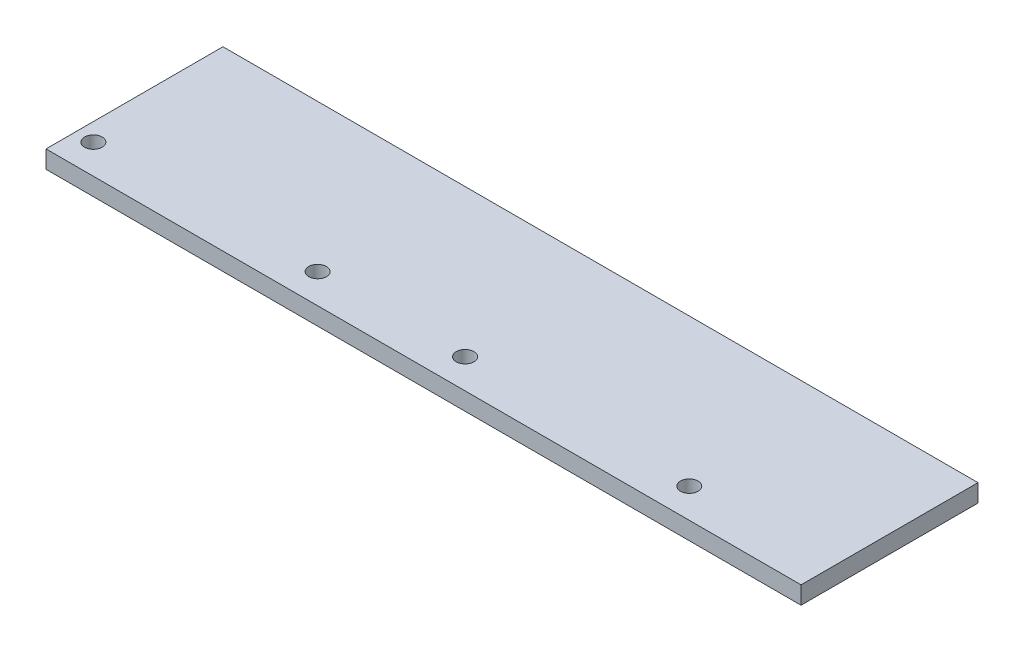
ISO-10303-21;
HEADER;
FILE_DESCRIPTION(('STEP AP214'),'2;1');
FILE_NAME('part.step','',(''),(''),'','','');
FILE_SCHEMA(('AUTOMOTIVE_DESIGN { 1 0 10303 214 1 1 1 1 }'));
ENDSEC;
DATA;
#1=APPLICATION_CONTEXT('core data for automotive mechanical design processes');
#2=APPLICATION_PROTOCOL_DEFINITION('international standard','automotive_design',2000,#1);
#3=PRODUCT_CONTEXT('',#1,'mechanical');
#4=PRODUCT('Part','Part','',(#3));
#5=PRODUCT_RELATED_PRODUCT_CATEGORY('part','',(#4));
#6=PRODUCT_DEFINITION_FORMATION('','',#4);
#7=PRODUCT_DEFINITION_CONTEXT('part definition',#1,'design');
#8=PRODUCT_DEFINITION('design','',#6,#7);
#9=PRODUCT_DEFINITION_SHAPE('','',#8);
#10=(LENGTH_UNIT() NAMED_UNIT(*) SI_UNIT(.MILLI.,.METRE.));
#11=(NAMED_UNIT(*) PLANE_ANGLE_UNIT() SI_UNIT($,.RADIAN.));
#12=(NAMED_UNIT(*) SI_UNIT($,.STERADIAN.) SOLID_ANGLE_UNIT());
#13=UNCERTAINTY_MEASURE_WITH_UNIT(LENGTH_MEASURE(1.E-05),#10,'distance_accuracy_value','');
#14=(GEOMETRIC_REPRESENTATION_CONTEXT(3) GLOBAL_UNCERTAINTY_ASSIGNED_CONTEXT((#13)) GLOBAL_UNIT_ASSIGNED_CONTEXT((#10,
#11,#12)) REPRESENTATION_CONTEXT('',''));
#15=CARTESIAN_POINT('',(0.,0.,0.));
#16=DIRECTION('',(0.,0.,1.));
#17=DIRECTION('',(1.,0.,0.));
#18=AXIS2_PLACEMENT_3D('',#15,#16,#17);
#19=CARTESIAN_POINT('',(0.,19.05,0.));
#20=DIRECTION('',(1.,0.,0.));
#21=DIRECTION('',(0.,0.,-1.));
#22=AXIS2_PLACEMENT_3D('',#19,#20,#21);
#23=PLANE('',#22);
#24=DIRECTION('',(0.,0.,1.));
#25=VECTOR('',#24,1.);
#26=CARTESIAN_POINT('',(0.,0.,0.));
#27=LINE('',#26,#25);
#28=CARTESIAN_POINT('',(0.,0.,0.));
#29=VERTEX_POINT('',#28);
#30=CARTESIAN_POINT('',(0.,0.,190.5));
#31=VERTEX_POINT('',#30);
#32=EDGE_CURVE('E105',#29,#31,#27,.T.);
#33=ORIENTED_EDGE('',*,*,#32,.T.);
#34=DIRECTION('',(0.,-1.,0.));
#35=VECTOR('',#34,1.);
#36=CARTESIAN_POINT('',(0.,19.05,190.5));
#37=LINE('',#36,#35);
#38=CARTESIAN_POINT('',(0.,19.05,190.5));
#39=VERTEX_POINT('',#38);
#40=EDGE_CURVE('E11',#39,#31,#37,.T.);
#41=ORIENTED_EDGE('',*,*,#40,.F.);
#42=DIRECTION('',(0.,0.,1.));
#43=VECTOR('',#42,1.);
#44=CARTESIAN_POINT('',(0.,19.05,0.));
#45=LINE('',#44,#43);
#46=CARTESIAN_POINT('',(0.,19.05,0.));
#47=VERTEX_POINT('',#46);
#48=EDGE_CURVE('E89',#47,#39,#45,.T.);
#49=ORIENTED_EDGE('',*,*,#48,.F.);
#50=DIRECTION('',(0.,-1.,0.));
#51=VECTOR('',#50,1.);
#52=CARTESIAN_POINT('',(0.,19.05,0.));
#53=LINE('',#52,#51);
#54=EDGE_CURVE('E97',#47,#29,#53,.T.);
#55=ORIENTED_EDGE('',*,*,#54,.T.);
#56=EDGE_LOOP('',(#33,#41,#49,#55));
#57=FACE_BOUND('',#56,.T.);
#58=ADVANCED_FACE('F39',(#57),#23,.F.);
#59=CARTESIAN_POINT('',(0.,19.05,190.5));
#60=DIRECTION('',(0.,0.,-1.));
#61=DIRECTION('',(-1.,0.,0.));
#62=AXIS2_PLACEMENT_3D('',#59,#60,#61);
#63=PLANE('',#62);
#64=DIRECTION('',(1.,0.,0.));
#65=VECTOR('',#64,1.);
#66=CARTESIAN_POINT('',(0.,0.,190.5));
#67=LINE('',#66,#65);
#68=CARTESIAN_POINT('',(812.8,0.,190.5));
#69=VERTEX_POINT('',#68);
#70=EDGE_CURVE('E92',#31,#69,#67,.T.);
#71=ORIENTED_EDGE('',*,*,#70,.T.);
#72=DIRECTION('',(0.,-1.,0.));
#73=VECTOR('',#72,1.);
#74=CARTESIAN_POINT('',(812.8,19.05,190.5));
#75=LINE('',#74,#73);
#76=CARTESIAN_POINT('',(812.8,19.05,190.5));
#77=VERTEX_POINT('',#76);
#78=EDGE_CURVE('E50',#77,#69,#75,.T.);
#79=ORIENTED_EDGE('',*,*,#78,.F.);
#80=DIRECTION('',(1.,0.,0.));
#81=VECTOR('',#80,1.);
#82=CARTESIAN_POINT('',(0.,19.05,190.5));
#83=LINE('',#82,#81);
#84=EDGE_CURVE('E82',#39,#77,#83,.T.);
#85=ORIENTED_EDGE('',*,*,#84,.F.);
#86=ORIENTED_EDGE('',*,*,#40,.T.);
#87=EDGE_LOOP('',(#71,#79,#85,#86));
#88=FACE_BOUND('',#87,.T.);
#89=ADVANCED_FACE('F93',(#88),#63,.F.);
#90=CARTESIAN_POINT('',(812.8,19.05,0.));
#91=DIRECTION('',(-1.,0.,0.));
#92=DIRECTION('',(0.,0.,1.));
#93=AXIS2_PLACEMENT_3D('',#90,#91,#92);
#94=PLANE('',#93);
#95=DIRECTION('',(0.,0.,-1.));
#96=VECTOR('',#95,1.);
#97=CARTESIAN_POINT('',(812.8,0.,0.));
#98=LINE('',#97,#96);
#99=CARTESIAN_POINT('',(812.8,0.,0.));
#100=VERTEX_POINT('',#99);
#101=EDGE_CURVE('E75',#69,#100,#98,.T.);
#102=ORIENTED_EDGE('',*,*,#101,.T.);
#103=DIRECTION('',(0.,-1.,0.));
#104=VECTOR('',#103,1.);
#105=CARTESIAN_POINT('',(812.8,19.05,0.));
#106=LINE('',#105,#104);
#107=CARTESIAN_POINT('',(812.8,19.05,0.));
#108=VERTEX_POINT('',#107);
#109=EDGE_CURVE('E94',#108,#100,#106,.T.);
#110=ORIENTED_EDGE('',*,*,#109,.F.);
#111=DIRECTION('',(0.,0.,-1.));
#112=VECTOR('',#111,1.);
#113=CARTESIAN_POINT('',(812.8,19.05,0.));
#114=LINE('',#113,#112);
#115=EDGE_CURVE('E88',#77,#108,#114,.T.);
#116=ORIENTED_EDGE('',*,*,#115,.F.);
#117=ORIENTED_EDGE('',*,*,#78,.T.);
#118=EDGE_LOOP('',(#102,#110,#116,#117));
#119=FACE_BOUND('',#118,.T.);
#120=ADVANCED_FACE('F96',(#119),#94,.F.);
#121=CARTESIAN_POINT('',(0.,19.05,0.));
#122=DIRECTION('',(0.,0.,1.));
#123=DIRECTION('',(1.,0.,0.));
#124=AXIS2_PLACEMENT_3D('',#121,#122,#123);
#125=PLANE('',#124);
#126=DIRECTION('',(-1.,0.,0.));
#127=VECTOR('',#126,1.);
#128=CARTESIAN_POINT('',(0.,0.,0.));
#129=LINE('',#128,#127);
#130=EDGE_CURVE('E76',#100,#29,#129,.T.);
#131=ORIENTED_EDGE('',*,*,#130,.T.);
#132=ORIENTED_EDGE('',*,*,#54,.F.);
#133=DIRECTION('',(-1.,0.,0.));
#134=VECTOR('',#133,1.);
#135=CARTESIAN_POINT('',(0.,19.05,0.));
#136=LINE('',#135,#134);
#137=EDGE_CURVE('E54',#108,#47,#136,.T.);
#138=ORIENTED_EDGE('',*,*,#137,.F.);
#139=ORIENTED_EDGE('',*,*,#109,.T.);
#140=EDGE_LOOP('',(#131,#132,#138,#139));
#141=FACE_BOUND('',#140,.T.);
#142=ADVANCED_FACE('F106',(#141),#125,.F.);
#143=CARTESIAN_POINT('',(0.,19.05,0.));
#144=DIRECTION('',(0.,1.,0.));
#145=DIRECTION('',(0.,0.,1.));
#146=AXIS2_PLACEMENT_3D('',#143,#144,#145);
#147=PLANE('',#146);
#148=CARTESIAN_POINT('',(19.1470487132102,19.05,158.66737781704));
#149=DIRECTION('',(0.,1.,0.));
#150=DIRECTION('',(0.,0.,1.));
#151=AXIS2_PLACEMENT_3D('',#148,#149,#150);
#152=CIRCLE('',#151,9.525);
#153=CARTESIAN_POINT('',(19.1470487132102,19.05,168.19237781704));
#154=VERTEX_POINT('',#153);
#155=EDGE_CURVE('E132',#154,#154,#152,.T.);
#156=ORIENTED_EDGE('',*,*,#155,.F.);
#157=EDGE_LOOP('',(#156));
#158=FACE_BOUND('',#157,.T.);
#159=CARTESIAN_POINT('',(260.547124516888,19.05,158.66737781704));
#160=DIRECTION('',(0.,1.,0.));
#161=DIRECTION('',(0.,0.,1.));
#162=AXIS2_PLACEMENT_3D('',#159,#160,#161);
#163=CIRCLE('',#162,9.52500000000002);
#164=CARTESIAN_POINT('',(260.547124516888,19.05,168.19237781704));
#165=VERTEX_POINT('',#164);
#166=EDGE_CURVE('E131',#165,#165,#163,.T.);
#167=ORIENTED_EDGE('',*,*,#166,.F.);
#168=EDGE_LOOP('',(#167));
#169=FACE_BOUND('',#168,.T.);
#170=CARTESIAN_POINT('',(419.288921469703,19.05,158.66737781704));
#171=DIRECTION('',(0.,1.,0.));
#172=DIRECTION('',(0.,0.,1.));
#173=AXIS2_PLACEMENT_3D('',#170,#171,#172);
#174=CIRCLE('',#173,9.52500000000002);
#175=CARTESIAN_POINT('',(419.288921469703,19.05,168.19237781704));
#176=VERTEX_POINT('',#175);
#177=EDGE_CURVE('E124',#176,#176,#174,.T.);
#178=ORIENTED_EDGE('',*,*,#177,.F.);
#179=EDGE_LOOP('',(#178));
#180=FACE_BOUND('',#179,.T.);
#181=CARTESIAN_POINT('',(660.646560832095,19.05,158.66737781704));
#182=DIRECTION('',(0.,1.,0.));
#183=DIRECTION('',(0.,0.,1.));
#184=AXIS2_PLACEMENT_3D('',#181,#182,#183);
#185=CIRCLE('',#184,9.52500000000002);
#186=CARTESIAN_POINT('',(660.646560832095,19.05,168.19237781704));
#187=VERTEX_POINT('',#186);
#188=EDGE_CURVE('E119',#187,#187,#185,.T.);
#189=ORIENTED_EDGE('',*,*,#188,.F.);
#190=EDGE_LOOP('',(#189));
#191=FACE_BOUND('',#190,.T.);
#192=ORIENTED_EDGE('',*,*,#48,.T.);
#193=ORIENTED_EDGE('',*,*,#84,.T.);
#194=ORIENTED_EDGE('',*,*,#115,.T.);
#195=ORIENTED_EDGE('',*,*,#137,.T.);
#196=EDGE_LOOP('',(#192,#193,#194,#195));
#197=FACE_BOUND('',#196,.T.);
#198=ADVANCED_FACE('F86',(#158,#169,#180,#191,#197),#147,.T.);
#199=CARTESIAN_POINT('',(0.,0.,0.));
#200=DIRECTION('',(0.,1.,0.));
#201=DIRECTION('',(0.,0.,1.));
#202=AXIS2_PLACEMENT_3D('',#199,#200,#201);
#203=PLANE('',#202);
#204=CARTESIAN_POINT('',(19.1470487132102,0.,158.66737781704));
#205=DIRECTION('',(0.,1.,0.));
#206=DIRECTION('',(0.,0.,1.));
#207=AXIS2_PLACEMENT_3D('',#204,#205,#206);
#208=CIRCLE('',#207,9.525);
#209=CARTESIAN_POINT('',(19.1470487132102,0.,168.19237781704));
#210=VERTEX_POINT('',#209);
#211=EDGE_CURVE('E103',#210,#210,#208,.T.);
#212=ORIENTED_EDGE('',*,*,#211,.T.);
#213=EDGE_LOOP('',(#212));
#214=FACE_BOUND('',#213,.T.);
#215=CARTESIAN_POINT('',(260.547124516888,0.,158.66737781704));
#216=DIRECTION('',(0.,1.,0.));
#217=DIRECTION('',(0.,0.,1.));
#218=AXIS2_PLACEMENT_3D('',#215,#216,#217);
#219=CIRCLE('',#218,9.52500000000002);
#220=CARTESIAN_POINT('',(260.547124516888,0.,168.19237781704));
#221=VERTEX_POINT('',#220);
#222=EDGE_CURVE('E126',#221,#221,#219,.T.);
#223=ORIENTED_EDGE('',*,*,#222,.T.);
#224=EDGE_LOOP('',(#223));
#225=FACE_BOUND('',#224,.T.);
#226=CARTESIAN_POINT('',(419.288921469703,0.,158.66737781704));
#227=DIRECTION('',(0.,1.,0.));
#228=DIRECTION('',(0.,0.,1.));
#229=AXIS2_PLACEMENT_3D('',#226,#227,#228);
#230=CIRCLE('',#229,9.52500000000002);
#231=CARTESIAN_POINT('',(419.288921469703,0.,168.19237781704));
#232=VERTEX_POINT('',#231);
#233=EDGE_CURVE('E122',#232,#232,#230,.T.);
#234=ORIENTED_EDGE('',*,*,#233,.T.);
#235=EDGE_LOOP('',(#234));
#236=FACE_BOUND('',#235,.T.);
#237=CARTESIAN_POINT('',(660.646560832095,0.,158.66737781704));
#238=DIRECTION('',(0.,1.,0.));
#239=DIRECTION('',(0.,0.,1.));
#240=AXIS2_PLACEMENT_3D('',#237,#238,#239);
#241=CIRCLE('',#240,9.52500000000002);
#242=CARTESIAN_POINT('',(660.646560832095,0.,168.19237781704));
#243=VERTEX_POINT('',#242);
#244=EDGE_CURVE('E117',#243,#243,#241,.T.);
#245=ORIENTED_EDGE('',*,*,#244,.T.);
#246=EDGE_LOOP('',(#245));
#247=FACE_BOUND('',#246,.T.);
#248=ORIENTED_EDGE('',*,*,#32,.F.);
#249=ORIENTED_EDGE('',*,*,#130,.F.);
#250=ORIENTED_EDGE('',*,*,#101,.F.);
#251=ORIENTED_EDGE('',*,*,#70,.F.);
#252=EDGE_LOOP('',(#248,#249,#250,#251));
#253=FACE_BOUND('',#252,.T.);
#254=ADVANCED_FACE('F111',(#214,#225,#236,#247,#253),#203,.F.);
#255=CARTESIAN_POINT('',(660.646560832095,0.,158.66737781704));
#256=DIRECTION('',(0.,1.,0.));
#257=DIRECTION('',(0.,0.,1.));
#258=AXIS2_PLACEMENT_3D('',#255,#256,#257);
#259=CYLINDRICAL_SURFACE('',#258,9.52500000000002);
#260=CARTESIAN_POINT('',(660.646560832095,0.,168.19237781704));
#261=CARTESIAN_POINT('',(660.646560832095,0.1984375,168.19237781704));
#262=CARTESIAN_POINT('',(660.646560832095,0.396875,168.19237781704));
#263=CARTESIAN_POINT('',(660.646560832095,0.79375,168.19237781704));
#264=CARTESIAN_POINT('',(660.646560832095,0.9921875,168.19237781704));
#265=CARTESIAN_POINT('',(660.646560832095,1.3890625,168.19237781704));
#266=CARTESIAN_POINT('',(660.646560832095,1.5875,168.19237781704));
#267=CARTESIAN_POINT('',(660.646560832095,1.984375,168.19237781704));
#268=CARTESIAN_POINT('',(660.646560832095,2.1828125,168.19237781704));
#269=CARTESIAN_POINT('',(660.646560832095,2.5796875,168.19237781704));
#270=CARTESIAN_POINT('',(660.646560832095,2.778125,168.19237781704));
#271=CARTESIAN_POINT('',(660.646560832095,3.175,168.19237781704));
#272=CARTESIAN_POINT('',(660.646560832095,3.3734375,168.19237781704));
#273=CARTESIAN_POINT('',(660.646560832095,3.7703125,168.19237781704));
#274=CARTESIAN_POINT('',(660.646560832095,3.96875,168.19237781704));
#275=CARTESIAN_POINT('',(660.646560832095,4.365625,168.19237781704));
#276=CARTESIAN_POINT('',(660.646560832095,4.5640625,168.19237781704));
#277=CARTESIAN_POINT('',(660.646560832095,4.9609375,168.19237781704));
#278=CARTESIAN_POINT('',(660.646560832095,5.159375,168.19237781704));
#279=CARTESIAN_POINT('',(660.646560832095,5.55625,168.19237781704));
#280=CARTESIAN_POINT('',(660.646560832095,5.7546875,168.19237781704));
#281=CARTESIAN_POINT('',(660.646560832095,6.1515625,168.19237781704));
#282=CARTESIAN_POINT('',(660.646560832095,6.35,168.19237781704));
#283=CARTESIAN_POINT('',(660.646560832095,6.746875,168.19237781704));
#284=CARTESIAN_POINT('',(660.646560832095,6.9453125,168.19237781704));
#285=CARTESIAN_POINT('',(660.646560832095,7.3421875,168.19237781704));
#286=CARTESIAN_POINT('',(660.646560832095,7.540625,168.19237781704));
#287=CARTESIAN_POINT('',(660.646560832095,7.9375,168.19237781704));
#288=CARTESIAN_POINT('',(660.646560832095,8.1359375,168.19237781704));
#289=CARTESIAN_POINT('',(660.646560832095,8.5328125,168.19237781704));
#290=CARTESIAN_POINT('',(660.646560832095,8.73125,168.19237781704));
#291=CARTESIAN_POINT('',(660.646560832095,9.128125,168.19237781704));
#292=CARTESIAN_POINT('',(660.646560832095,9.3265625,168.19237781704));
#293=CARTESIAN_POINT('',(660.646560832095,9.7234375,168.19237781704));
#294=CARTESIAN_POINT('',(660.646560832095,9.921875,168.19237781704));
#295=CARTESIAN_POINT('',(660.646560832095,10.31875,168.19237781704));
#296=CARTESIAN_POINT('',(660.646560832095,10.5171875,168.19237781704));
#297=CARTESIAN_POINT('',(660.646560832095,10.9140625,168.19237781704));
#298=CARTESIAN_POINT('',(660.646560832095,11.1125,168.19237781704));
#299=CARTESIAN_POINT('',(660.646560832095,11.509375,168.19237781704));
#300=CARTESIAN_POINT('',(660.646560832095,11.7078125,168.19237781704));
#301=CARTESIAN_POINT('',(660.646560832095,12.1046875,168.19237781704));
#302=CARTESIAN_POINT('',(660.646560832095,12.303125,168.19237781704));
#303=CARTESIAN_POINT('',(660.646560832095,12.7,168.19237781704));
#304=CARTESIAN_POINT('',(660.646560832095,12.8984375,168.19237781704));
#305=CARTESIAN_POINT('',(660.646560832095,13.2953125,168.19237781704));
#306=CARTESIAN_POINT('',(660.646560832095,13.49375,168.19237781704));
#307=CARTESIAN_POINT('',(660.646560832095,13.890625,168.19237781704));
#308=CARTESIAN_POINT('',(660.646560832095,14.0890625,168.19237781704));
#309=CARTESIAN_POINT('',(660.646560832095,14.4859375,168.19237781704));
#310=CARTESIAN_POINT('',(660.646560832095,14.684375,168.19237781704));
#311=CARTESIAN_POINT('',(660.646560832095,15.08125,168.19237781704));
#312=CARTESIAN_POINT('',(660.646560832095,15.2796875,168.19237781704));
#313=CARTESIAN_POINT('',(660.646560832095,15.6765625,168.19237781704));
#314=CARTESIAN_POINT('',(660.646560832095,15.875,168.19237781704));
#315=CARTESIAN_POINT('',(660.646560832095,16.271875,168.19237781704));
#316=CARTESIAN_POINT('',(660.646560832095,16.4703125,168.19237781704));
#317=CARTESIAN_POINT('',(660.646560832095,16.8671875,168.19237781704));
#318=CARTESIAN_POINT('',(660.646560832095,17.065625,168.19237781704));
#319=CARTESIAN_POINT('',(660.646560832095,17.4625,168.19237781704));
#320=CARTESIAN_POINT('',(660.646560832095,17.6609375,168.19237781704));
#321=CARTESIAN_POINT('',(660.646560832095,18.0578125,168.19237781704));
#322=CARTESIAN_POINT('',(660.646560832095,18.25625,168.19237781704));
#323=CARTESIAN_POINT('',(660.646560832095,18.653125,168.19237781704));
#324=CARTESIAN_POINT('',(660.646560832095,18.8515625,168.19237781704));
#325=CARTESIAN_POINT('',(660.646560832095,19.05,168.19237781704));
#326=B_SPLINE_CURVE_WITH_KNOTS('',3,(#260,#261,#262,#263,#264,#265,#266,#267,#268,#269,#270,
#271,#272,#273,#274,#275,#276,#277,#278,#279,#280,#281,#282,#283,#284,#285,#286,#287,#288,#289,
#290,#291,#292,#293,#294,#295,#296,#297,#298,#299,#300,#301,#302,#303,#304,#305,#306,#307,#308,
#309,#310,#311,#312,#313,#314,#315,#316,#317,#318,#319,#320,#321,#322,#323,#324,#325),
.UNSPECIFIED.,.F.,.F.,(4,2,2,2,2,2,2,2,2,2,2,2,2,2,2,2,2,2,2,2,2,2,2,2,2,2,2,2,2,2,2,2,4),(0.,
0.5953125,1.190625,1.7859375,2.38125,2.9765625,3.571875,4.1671875,4.7625,5.3578125,5.953125,
6.5484375,7.14375,7.7390625,8.334375,8.9296875,9.525,10.1203125,10.715625,11.3109375,11.90625,
12.5015625,13.096875,13.6921875,14.2875,14.8828125,15.478125,16.0734375,16.66875,17.2640625,
17.859375,18.4546875,19.05),.UNSPECIFIED.);
#327=EDGE_CURVE('BSEAM156',#243,#187,#326,.T.);
#328=ORIENTED_EDGE('',*,*,#244,.F.);
#329=ORIENTED_EDGE('',*,*,#188,.T.);
#330=ORIENTED_EDGE('',*,*,#327,.T.);
#331=ORIENTED_EDGE('',*,*,#327,.F.);
#332=EDGE_LOOP('',(#328,#330,#329,#331));
#333=FACE_BOUND('',#332,.T.);
#334=ADVANCED_FACE('F156',(#333),#259,.F.);
#335=CARTESIAN_POINT('',(419.288921469703,0.,158.66737781704));
#336=DIRECTION('',(0.,1.,0.));
#337=DIRECTION('',(0.,0.,1.));
#338=AXIS2_PLACEMENT_3D('',#335,#336,#337);
#339=CYLINDRICAL_SURFACE('',#338,9.52500000000002);
#340=CARTESIAN_POINT('',(419.288921469703,0.,168.19237781704));
#341=CARTESIAN_POINT('',(419.288921469703,0.1984375,168.19237781704));
#342=CARTESIAN_POINT('',(419.288921469703,0.396875,168.19237781704));
#343=CARTESIAN_POINT('',(419.288921469703,0.79375,168.19237781704));
#344=CARTESIAN_POINT('',(419.288921469703,0.9921875,168.19237781704));
#345=CARTESIAN_POINT('',(419.288921469703,1.3890625,168.19237781704));
#346=CARTESIAN_POINT('',(419.288921469703,1.5875,168.19237781704));
#347=CARTESIAN_POINT('',(419.288921469703,1.984375,168.19237781704));
#348=CARTESIAN_POINT('',(419.288921469703,2.1828125,168.19237781704));
#349=CARTESIAN_POINT('',(419.288921469703,2.5796875,168.19237781704));
#350=CARTESIAN_POINT('',(419.288921469703,2.778125,168.19237781704));
#351=CARTESIAN_POINT('',(419.288921469703,3.175,168.19237781704));
#352=CARTESIAN_POINT('',(419.288921469703,3.3734375,168.19237781704));
#353=CARTESIAN_POINT('',(419.288921469703,3.7703125,168.19237781704));
#354=CARTESIAN_POINT('',(419.288921469703,3.96875,168.19237781704));
#355=CARTESIAN_POINT('',(419.288921469703,4.365625,168.19237781704));
#356=CARTESIAN_POINT('',(419.288921469703,4.5640625,168.19237781704));
#357=CARTESIAN_POINT('',(419.288921469703,4.9609375,168.19237781704));
#358=CARTESIAN_POINT('',(419.288921469703,5.159375,168.19237781704));
#359=CARTESIAN_POINT('',(419.288921469703,5.55625,168.19237781704));
#360=CARTESIAN_POINT('',(419.288921469703,5.7546875,168.19237781704));
#361=CARTESIAN_POINT('',(419.288921469703,6.1515625,168.19237781704));
#362=CARTESIAN_POINT('',(419.288921469703,6.35,168.19237781704));
#363=CARTESIAN_POINT('',(419.288921469703,6.746875,168.19237781704));
#364=CARTESIAN_POINT('',(419.288921469703,6.9453125,168.19237781704));
#365=CARTESIAN_POINT('',(419.288921469703,7.3421875,168.19237781704));
#366=CARTESIAN_POINT('',(419.288921469703,7.540625,168.19237781704));
#367=CARTESIAN_POINT('',(419.288921469703,7.9375,168.19237781704));
#368=CARTESIAN_POINT('',(419.288921469703,8.1359375,168.19237781704));
#369=CARTESIAN_POINT('',(419.288921469703,8.5328125,168.19237781704));
#370=CARTESIAN_POINT('',(419.288921469703,8.73125,168.19237781704));
#371=CARTESIAN_POINT('',(419.288921469703,9.128125,168.19237781704));
#372=CARTESIAN_POINT('',(419.288921469703,9.3265625,168.19237781704));
#373=CARTESIAN_POINT('',(419.288921469703,9.7234375,168.19237781704));
#374=CARTESIAN_POINT('',(419.288921469703,9.921875,168.19237781704));
#375=CARTESIAN_POINT('',(419.288921469703,10.31875,168.19237781704));
#376=CARTESIAN_POINT('',(419.288921469703,10.5171875,168.19237781704));
#377=CARTESIAN_POINT('',(419.288921469703,10.9140625,168.19237781704));
#378=CARTESIAN_POINT('',(419.288921469703,11.1125,168.19237781704));
#379=CARTESIAN_POINT('',(419.288921469703,11.509375,168.19237781704));
#380=CARTESIAN_POINT('',(419.288921469703,11.7078125,168.19237781704));
#381=CARTESIAN_POINT('',(419.288921469703,12.1046875,168.19237781704));
#382=CARTESIAN_POINT('',(419.288921469703,12.303125,168.19237781704));
#383=CARTESIAN_POINT('',(419.288921469703,12.7,168.19237781704));
#384=CARTESIAN_POINT('',(419.288921469703,12.8984375,168.19237781704));
#385=CARTESIAN_POINT('',(419.288921469703,13.2953125,168.19237781704));
#386=CARTESIAN_POINT('',(419.288921469703,13.49375,168.19237781704));
#387=CARTESIAN_POINT('',(419.288921469703,13.890625,168.19237781704));
#388=CARTESIAN_POINT('',(419.288921469703,14.0890625,168.19237781704));
#389=CARTESIAN_POINT('',(419.288921469703,14.4859375,168.19237781704));
#390=CARTESIAN_POINT('',(419.288921469703,14.684375,168.19237781704));
#391=CARTESIAN_POINT('',(419.288921469703,15.08125,168.19237781704));
#392=CARTESIAN_POINT('',(419.288921469703,15.2796875,168.19237781704));
#393=CARTESIAN_POINT('',(419.288921469703,15.6765625,168.19237781704));
#394=CARTESIAN_POINT('',(419.288921469703,15.875,168.19237781704));
#395=CARTESIAN_POINT('',(419.288921469703,16.271875,168.19237781704));
#396=CARTESIAN_POINT('',(419.288921469703,16.4703125,168.19237781704));
#397=CARTESIAN_POINT('',(419.288921469703,16.8671875,168.19237781704));
#398=CARTESIAN_POINT('',(419.288921469703,17.065625,168.19237781704));
#399=CARTESIAN_POINT('',(419.288921469703,17.4625,168.19237781704));
#400=CARTESIAN_POINT('',(419.288921469703,17.6609375,168.19237781704));
#401=CARTESIAN_POINT('',(419.288921469703,18.0578125,168.19237781704));
#402=CARTESIAN_POINT('',(419.288921469703,18.25625,168.19237781704));
#403=CARTESIAN_POINT('',(419.288921469703,18.653125,168.19237781704));
#404=CARTESIAN_POINT('',(419.288921469703,18.8515625,168.19237781704));
#405=CARTESIAN_POINT('',(419.288921469703,19.05,168.19237781704));
#406=B_SPLINE_CURVE_WITH_KNOTS('',3,(#340,#341,#342,#343,#344,#345,#346,#347,#348,#349,#350,
#351,#352,#353,#354,#355,#356,#357,#358,#359,#360,#361,#362,#363,#364,#365,#366,#367,#368,#369,
#370,#371,#372,#373,#374,#375,#376,#377,#378,#379,#380,#381,#382,#383,#384,#385,#386,#387,#388,
#389,#390,#391,#392,#393,#394,#395,#396,#397,#398,#399,#400,#401,#402,#403,#404,#405),
.UNSPECIFIED.,.F.,.F.,(4,2,2,2,2,2,2,2,2,2,2,2,2,2,2,2,2,2,2,2,2,2,2,2,2,2,2,2,2,2,2,2,4),(0.,
0.5953125,1.190625,1.7859375,2.38125,2.9765625,3.571875,4.1671875,4.7625,5.3578125,5.953125,
6.5484375,7.14375,7.7390625,8.334375,8.9296875,9.525,10.1203125,10.715625,11.3109375,11.90625,
12.5015625,13.096875,13.6921875,14.2875,14.8828125,15.478125,16.0734375,16.66875,17.2640625,
17.859375,18.4546875,19.05),.UNSPECIFIED.);
#407=EDGE_CURVE('BSEAM158',#232,#176,#406,.T.);
#408=ORIENTED_EDGE('',*,*,#233,.F.);
#409=ORIENTED_EDGE('',*,*,#177,.T.);
#410=ORIENTED_EDGE('',*,*,#407,.T.);
#411=ORIENTED_EDGE('',*,*,#407,.F.);
#412=EDGE_LOOP('',(#408,#410,#409,#411));
#413=FACE_BOUND('',#412,.T.);
#414=ADVANCED_FACE('F158',(#413),#339,.F.);
#415=CARTESIAN_POINT('',(260.547124516888,0.,158.66737781704));
#416=DIRECTION('',(0.,1.,0.));
#417=DIRECTION('',(0.,0.,1.));
#418=AXIS2_PLACEMENT_3D('',#415,#416,#417);
#419=CYLINDRICAL_SURFACE('',#418,9.52500000000002);
#420=CARTESIAN_POINT('',(260.547124516888,0.,168.19237781704));
#421=CARTESIAN_POINT('',(260.547124516888,0.1984375,168.19237781704));
#422=CARTESIAN_POINT('',(260.547124516888,0.396875,168.19237781704));
#423=CARTESIAN_POINT('',(260.547124516888,0.79375,168.19237781704));
#424=CARTESIAN_POINT('',(260.547124516888,0.9921875,168.19237781704));
#425=CARTESIAN_POINT('',(260.547124516888,1.3890625,168.19237781704));
#426=CARTESIAN_POINT('',(260.547124516888,1.5875,168.19237781704));
#427=CARTESIAN_POINT('',(260.547124516888,1.984375,168.19237781704));
#428=CARTESIAN_POINT('',(260.547124516888,2.1828125,168.19237781704));
#429=CARTESIAN_POINT('',(260.547124516888,2.5796875,168.19237781704));
#430=CARTESIAN_POINT('',(260.547124516888,2.778125,168.19237781704));
#431=CARTESIAN_POINT('',(260.547124516888,3.175,168.19237781704));
#432=CARTESIAN_POINT('',(260.547124516888,3.3734375,168.19237781704));
#433=CARTESIAN_POINT('',(260.547124516888,3.7703125,168.19237781704));
#434=CARTESIAN_POINT('',(260.547124516888,3.96875,168.19237781704));
#435=CARTESIAN_POINT('',(260.547124516888,4.365625,168.19237781704));
#436=CARTESIAN_POINT('',(260.547124516888,4.5640625,168.19237781704));
#437=CARTESIAN_POINT('',(260.547124516888,4.9609375,168.19237781704));
#438=CARTESIAN_POINT('',(260.547124516888,5.159375,168.19237781704));
#439=CARTESIAN_POINT('',(260.547124516888,5.55625,168.19237781704));
#440=CARTESIAN_POINT('',(260.547124516888,5.7546875,168.19237781704));
#441=CARTESIAN_POINT('',(260.547124516888,6.1515625,168.19237781704));
#442=CARTESIAN_POINT('',(260.547124516888,6.35,168.19237781704));
#443=CARTESIAN_POINT('',(260.547124516888,6.746875,168.19237781704));
#444=CARTESIAN_POINT('',(260.547124516888,6.9453125,168.19237781704));
#445=CARTESIAN_POINT('',(260.547124516888,7.3421875,168.19237781704));
#446=CARTESIAN_POINT('',(260.547124516888,7.540625,168.19237781704));
#447=CARTESIAN_POINT('',(260.547124516888,7.9375,168.19237781704));
#448=CARTESIAN_POINT('',(260.547124516888,8.1359375,168.19237781704));
#449=CARTESIAN_POINT('',(260.547124516888,8.5328125,168.19237781704));
#450=CARTESIAN_POINT('',(260.547124516888,8.73125,168.19237781704));
#451=CARTESIAN_POINT('',(260.547124516888,9.128125,168.19237781704));
#452=CARTESIAN_POINT('',(260.547124516888,9.3265625,168.19237781704));
#453=CARTESIAN_POINT('',(260.547124516888,9.7234375,168.19237781704));
#454=CARTESIAN_POINT('',(260.547124516888,9.921875,168.19237781704));
#455=CARTESIAN_POINT('',(260.547124516888,10.31875,168.19237781704));
#456=CARTESIAN_POINT('',(260.547124516888,10.5171875,168.19237781704));
#457=CARTESIAN_POINT('',(260.547124516888,10.9140625,168.19237781704));
#458=CARTESIAN_POINT('',(260.547124516888,11.1125,168.19237781704));
#459=CARTESIAN_POINT('',(260.547124516888,11.509375,168.19237781704));
#460=CARTESIAN_POINT('',(260.547124516888,11.7078125,168.19237781704));
#461=CARTESIAN_POINT('',(260.547124516888,12.1046875,168.19237781704));
#462=CARTESIAN_POINT('',(260.547124516888,12.303125,168.19237781704));
#463=CARTESIAN_POINT('',(260.547124516888,12.7,168.19237781704));
#464=CARTESIAN_POINT('',(260.547124516888,12.8984375,168.19237781704));
#465=CARTESIAN_POINT('',(260.547124516888,13.2953125,168.19237781704));
#466=CARTESIAN_POINT('',(260.547124516888,13.49375,168.19237781704));
#467=CARTESIAN_POINT('',(260.547124516888,13.890625,168.19237781704));
#468=CARTESIAN_POINT('',(260.547124516888,14.0890625,168.19237781704));
#469=CARTESIAN_POINT('',(260.547124516888,14.4859375,168.19237781704));
#470=CARTESIAN_POINT('',(260.547124516888,14.684375,168.19237781704));
#471=CARTESIAN_POINT('',(260.547124516888,15.08125,168.19237781704));
#472=CARTESIAN_POINT('',(260.547124516888,15.2796875,168.19237781704));
#473=CARTESIAN_POINT('',(260.547124516888,15.6765625,168.19237781704));
#474=CARTESIAN_POINT('',(260.547124516888,15.875,168.19237781704));
#475=CARTESIAN_POINT('',(260.547124516888,16.271875,168.19237781704));
#476=CARTESIAN_POINT('',(260.547124516888,16.4703125,168.19237781704));
#477=CARTESIAN_POINT('',(260.547124516888,16.8671875,168.19237781704));
#478=CARTESIAN_POINT('',(260.547124516888,17.065625,168.19237781704));
#479=CARTESIAN_POINT('',(260.547124516888,17.4625,168.19237781704));
#480=CARTESIAN_POINT('',(260.547124516888,17.6609375,168.19237781704));
#481=CARTESIAN_POINT('',(260.547124516888,18.0578125,168.19237781704));
#482=CARTESIAN_POINT('',(260.547124516888,18.25625,168.19237781704));
#483=CARTESIAN_POINT('',(260.547124516888,18.653125,168.19237781704));
#484=CARTESIAN_POINT('',(260.547124516888,18.8515625,168.19237781704));
#485=CARTESIAN_POINT('',(260.547124516888,19.05,168.19237781704));
#486=B_SPLINE_CURVE_WITH_KNOTS('',3,(#420,#421,#422,#423,#424,#425,#426,#427,#428,#429,#430,
#431,#432,#433,#434,#435,#436,#437,#438,#439,#440,#441,#442,#443,#444,#445,#446,#447,#448,#449,
#450,#451,#452,#453,#454,#455,#456,#457,#458,#459,#460,#461,#462,#463,#464,#465,#466,#467,#468,
#469,#470,#471,#472,#473,#474,#475,#476,#477,#478,#479,#480,#481,#482,#483,#484,#485),
.UNSPECIFIED.,.F.,.F.,(4,2,2,2,2,2,2,2,2,2,2,2,2,2,2,2,2,2,2,2,2,2,2,2,2,2,2,2,2,2,2,2,4),(0.,
0.5953125,1.190625,1.7859375,2.38125,2.9765625,3.571875,4.1671875,4.7625,5.3578125,5.953125,
6.5484375,7.14375,7.7390625,8.334375,8.9296875,9.525,10.1203125,10.715625,11.3109375,11.90625,
12.5015625,13.096875,13.6921875,14.2875,14.8828125,15.478125,16.0734375,16.66875,17.2640625,
17.859375,18.4546875,19.05),.UNSPECIFIED.);
#487=EDGE_CURVE('BSEAM144',#221,#165,#486,.T.);
#488=ORIENTED_EDGE('',*,*,#222,.F.);
#489=ORIENTED_EDGE('',*,*,#166,.T.);
#490=ORIENTED_EDGE('',*,*,#487,.T.);
#491=ORIENTED_EDGE('',*,*,#487,.F.);
#492=EDGE_LOOP('',(#488,#490,#489,#491));
#493=FACE_BOUND('',#492,.T.);
#494=ADVANCED_FACE('F144',(#493),#419,.F.);
#495=CARTESIAN_POINT('',(19.1470487132102,0.,158.66737781704));
#496=DIRECTION('',(0.,1.,0.));
#497=DIRECTION('',(0.,0.,1.));
#498=AXIS2_PLACEMENT_3D('',#495,#496,#497);
#499=CYLINDRICAL_SURFACE('',#498,9.525);
#500=CARTESIAN_POINT('',(19.1470487132102,0.,168.19237781704));
#501=CARTESIAN_POINT('',(19.1470487132102,0.1984375,168.19237781704));
#502=CARTESIAN_POINT('',(19.1470487132102,0.396875,168.19237781704));
#503=CARTESIAN_POINT('',(19.1470487132102,0.79375,168.19237781704));
#504=CARTESIAN_POINT('',(19.1470487132102,0.9921875,168.19237781704));
#505=CARTESIAN_POINT('',(19.1470487132102,1.3890625,168.19237781704));
#506=CARTESIAN_POINT('',(19.1470487132102,1.5875,168.19237781704));
#507=CARTESIAN_POINT('',(19.1470487132102,1.984375,168.19237781704));
#508=CARTESIAN_POINT('',(19.1470487132102,2.1828125,168.19237781704));
#509=CARTESIAN_POINT('',(19.1470487132102,2.5796875,168.19237781704));
#510=CARTESIAN_POINT('',(19.1470487132102,2.778125,168.19237781704));
#511=CARTESIAN_POINT('',(19.1470487132102,3.175,168.19237781704));
#512=CARTESIAN_POINT('',(19.1470487132102,3.3734375,168.19237781704));
#513=CARTESIAN_POINT('',(19.1470487132102,3.7703125,168.19237781704));
#514=CARTESIAN_POINT('',(19.1470487132102,3.96875,168.19237781704));
#515=CARTESIAN_POINT('',(19.1470487132102,4.365625,168.19237781704));
#516=CARTESIAN_POINT('',(19.1470487132102,4.5640625,168.19237781704));
#517=CARTESIAN_POINT('',(19.1470487132102,4.9609375,168.19237781704));
#518=CARTESIAN_POINT('',(19.1470487132102,5.159375,168.19237781704));
#519=CARTESIAN_POINT('',(19.1470487132102,5.55625,168.19237781704));
#520=CARTESIAN_POINT('',(19.1470487132102,5.7546875,168.19237781704));
#521=CARTESIAN_POINT('',(19.1470487132102,6.1515625,168.19237781704));
#522=CARTESIAN_POINT('',(19.1470487132102,6.35,168.19237781704));
#523=CARTESIAN_POINT('',(19.1470487132102,6.746875,168.19237781704));
#524=CARTESIAN_POINT('',(19.1470487132102,6.9453125,168.19237781704));
#525=CARTESIAN_POINT('',(19.1470487132102,7.3421875,168.19237781704));
#526=CARTESIAN_POINT('',(19.1470487132102,7.540625,168.19237781704));
#527=CARTESIAN_POINT('',(19.1470487132102,7.9375,168.19237781704));
#528=CARTESIAN_POINT('',(19.1470487132102,8.1359375,168.19237781704));
#529=CARTESIAN_POINT('',(19.1470487132102,8.5328125,168.19237781704));
#530=CARTESIAN_POINT('',(19.1470487132102,8.73125,168.19237781704));
#531=CARTESIAN_POINT('',(19.1470487132102,9.128125,168.19237781704));
#532=CARTESIAN_POINT('',(19.1470487132102,9.3265625,168.19237781704));
#533=CARTESIAN_POINT('',(19.1470487132102,9.7234375,168.19237781704));
#534=CARTESIAN_POINT('',(19.1470487132102,9.921875,168.19237781704));
#535=CARTESIAN_POINT('',(19.1470487132102,10.31875,168.19237781704));
#536=CARTESIAN_POINT('',(19.1470487132102,10.5171875,168.19237781704));
#537=CARTESIAN_POINT('',(19.1470487132102,10.9140625,168.19237781704));
#538=CARTESIAN_POINT('',(19.1470487132102,11.1125,168.19237781704));
#539=CARTESIAN_POINT('',(19.1470487132102,11.509375,168.19237781704));
#540=CARTESIAN_POINT('',(19.1470487132102,11.7078125,168.19237781704));
#541=CARTESIAN_POINT('',(19.1470487132102,12.1046875,168.19237781704));
#542=CARTESIAN_POINT('',(19.1470487132102,12.303125,168.19237781704));
#543=CARTESIAN_POINT('',(19.1470487132102,12.7,168.19237781704));
#544=CARTESIAN_POINT('',(19.1470487132102,12.8984375,168.19237781704));
#545=CARTESIAN_POINT('',(19.1470487132102,13.2953125,168.19237781704));
#546=CARTESIAN_POINT('',(19.1470487132102,13.49375,168.19237781704));
#547=CARTESIAN_POINT('',(19.1470487132102,13.890625,168.19237781704));
#548=CARTESIAN_POINT('',(19.1470487132102,14.0890625,168.19237781704));
#549=CARTESIAN_POINT('',(19.1470487132102,14.4859375,168.19237781704));
#550=CARTESIAN_POINT('',(19.1470487132102,14.684375,168.19237781704));
#551=CARTESIAN_POINT('',(19.1470487132102,15.08125,168.19237781704));
#552=CARTESIAN_POINT('',(19.1470487132102,15.2796875,168.19237781704));
#553=CARTESIAN_POINT('',(19.1470487132102,15.6765625,168.19237781704));
#554=CARTESIAN_POINT('',(19.1470487132102,15.875,168.19237781704));
#555=CARTESIAN_POINT('',(19.1470487132102,16.271875,168.19237781704));
#556=CARTESIAN_POINT('',(19.1470487132102,16.4703125,168.19237781704));
#557=CARTESIAN_POINT('',(19.1470487132102,16.8671875,168.19237781704));
#558=CARTESIAN_POINT('',(19.1470487132102,17.065625,168.19237781704));
#559=CARTESIAN_POINT('',(19.1470487132102,17.4625,168.19237781704));
#560=CARTESIAN_POINT('',(19.1470487132102,17.6609375,168.19237781704));
#561=CARTESIAN_POINT('',(19.1470487132102,18.0578125,168.19237781704));
#562=CARTESIAN_POINT('',(19.1470487132102,18.25625,168.19237781704));
#563=CARTESIAN_POINT('',(19.1470487132102,18.653125,168.19237781704));
#564=CARTESIAN_POINT('',(19.1470487132102,18.8515625,168.19237781704));
#565=CARTESIAN_POINT('',(19.1470487132102,19.05,168.19237781704));
#566=B_SPLINE_CURVE_WITH_KNOTS('',3,(#500,#501,#502,#503,#504,#505,#506,#507,#508,#509,#510,
#511,#512,#513,#514,#515,#516,#517,#518,#519,#520,#521,#522,#523,#524,#525,#526,#527,#528,#529,
#530,#531,#532,#533,#534,#535,#536,#537,#538,#539,#540,#541,#542,#543,#544,#545,#546,#547,#548,
#549,#550,#551,#552,#553,#554,#555,#556,#557,#558,#559,#560,#561,#562,#563,#564,#565),
.UNSPECIFIED.,.F.,.F.,(4,2,2,2,2,2,2,2,2,2,2,2,2,2,2,2,2,2,2,2,2,2,2,2,2,2,2,2,2,2,2,2,4),(0.,
0.5953125,1.190625,1.7859375,2.38125,2.9765625,3.571875,4.1671875,4.7625,5.3578125,5.953125,
6.5484375,7.14375,7.7390625,8.334375,8.9296875,9.525,10.1203125,10.715625,11.3109375,11.90625,
12.5015625,13.096875,13.6921875,14.2875,14.8828125,15.478125,16.0734375,16.66875,17.2640625,
17.859375,18.4546875,19.05),.UNSPECIFIED.);
#567=EDGE_CURVE('BSEAM145',#210,#154,#566,.T.);
#568=ORIENTED_EDGE('',*,*,#211,.F.);
#569=ORIENTED_EDGE('',*,*,#155,.T.);
#570=ORIENTED_EDGE('',*,*,#567,.T.);
#571=ORIENTED_EDGE('',*,*,#567,.F.);
#572=EDGE_LOOP('',(#568,#570,#569,#571));
#573=FACE_BOUND('',#572,.T.);
#574=ADVANCED_FACE('F145',(#573),#499,.F.);
#575=CLOSED_SHELL('',(#58,#89,#120,#142,#198,#254,#334,#414,#494,#574));
#576=MANIFOLD_SOLID_BREP('B2',#575);
#577=ADVANCED_BREP_SHAPE_REPRESENTATION('',(#18,#576),#14);
#578=SHAPE_DEFINITION_REPRESENTATION(#9,#577);
ENDSEC;
END-ISO-10303-21;
